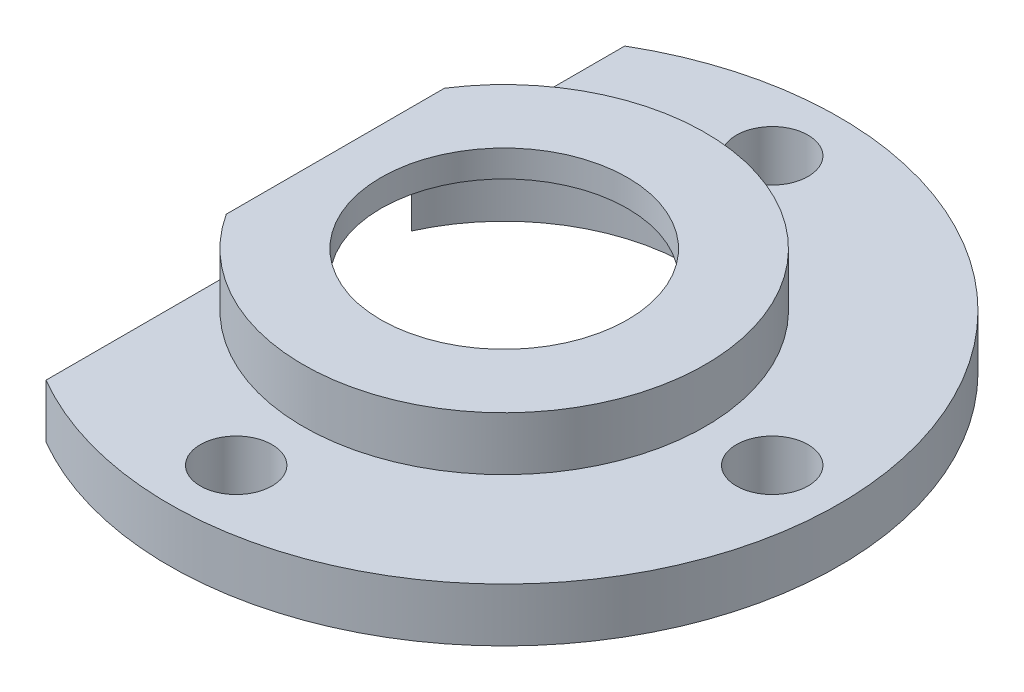
ISO-10303-21;
HEADER;
FILE_DESCRIPTION(('STEP AP214'),'2;1');
FILE_NAME('part.step','',(''),(''),'','','');
FILE_SCHEMA(('AUTOMOTIVE_DESIGN { 1 0 10303 214 1 1 1 1 }'));
ENDSEC;
DATA;
#1=APPLICATION_CONTEXT('core data for automotive mechanical design processes');
#2=APPLICATION_PROTOCOL_DEFINITION('international standard','automotive_design',2000,#1);
#3=PRODUCT_CONTEXT('',#1,'mechanical');
#4=PRODUCT('Part','Part','',(#3));
#5=PRODUCT_RELATED_PRODUCT_CATEGORY('part','',(#4));
#6=PRODUCT_DEFINITION_FORMATION('','',#4);
#7=PRODUCT_DEFINITION_CONTEXT('part definition',#1,'design');
#8=PRODUCT_DEFINITION('design','',#6,#7);
#9=PRODUCT_DEFINITION_SHAPE('','',#8);
#10=(LENGTH_UNIT() NAMED_UNIT(*) SI_UNIT(.MILLI.,.METRE.));
#11=(NAMED_UNIT(*) PLANE_ANGLE_UNIT() SI_UNIT($,.RADIAN.));
#12=(NAMED_UNIT(*) SI_UNIT($,.STERADIAN.) SOLID_ANGLE_UNIT());
#13=UNCERTAINTY_MEASURE_WITH_UNIT(LENGTH_MEASURE(1.E-05),#10,'distance_accuracy_value','');
#14=(GEOMETRIC_REPRESENTATION_CONTEXT(3) GLOBAL_UNCERTAINTY_ASSIGNED_CONTEXT((#13)) GLOBAL_UNIT_ASSIGNED_CONTEXT((#10,
#11,#12)) REPRESENTATION_CONTEXT('',''));
#15=CARTESIAN_POINT('',(0.,0.,0.));
#16=DIRECTION('',(0.,0.,1.));
#17=DIRECTION('',(1.,0.,0.));
#18=AXIS2_PLACEMENT_3D('',#15,#16,#17);
#19=CARTESIAN_POINT('',(0.,2.54,0.));
#20=DIRECTION('',(0.,-1.,0.));
#21=DIRECTION('',(0.,0.,-1.));
#22=AXIS2_PLACEMENT_3D('',#19,#20,#21);
#23=CYLINDRICAL_SURFACE('',#22,15.875);
#24=DIRECTION('',(0.,-1.,0.));
#25=VECTOR('',#24,1.);
#26=CARTESIAN_POINT('',(-8.,5.33400000000001,-13.7118789740867));
#27=LINE('',#26,#25);
#28=CARTESIAN_POINT('',(-8.,2.54,-13.7118789740867));
#29=VERTEX_POINT('',#28);
#30=CARTESIAN_POINT('',(-8.,0.,-13.7118789740867));
#31=VERTEX_POINT('',#30);
#32=EDGE_CURVE('E92',#29,#31,#27,.T.);
#33=ORIENTED_EDGE('',*,*,#32,.F.);
#34=CARTESIAN_POINT('',(0.,2.54,0.));
#35=DIRECTION('',(0.,1.,0.));
#36=DIRECTION('',(0.,0.,1.));
#37=AXIS2_PLACEMENT_3D('',#34,#35,#36);
#38=CIRCLE('',#37,15.875);
#39=CARTESIAN_POINT('',(-8.,2.54,13.7118789740867));
#40=VERTEX_POINT('',#39);
#41=EDGE_CURVE('E118',#40,#29,#38,.T.);
#42=ORIENTED_EDGE('',*,*,#41,.F.);
#43=DIRECTION('',(0.,-1.,0.));
#44=VECTOR('',#43,1.);
#45=CARTESIAN_POINT('',(-8.,5.33400000000001,13.7118789740867));
#46=LINE('',#45,#44);
#47=CARTESIAN_POINT('',(-8.,0.,13.7118789740867));
#48=VERTEX_POINT('',#47);
#49=EDGE_CURVE('E104',#40,#48,#46,.T.);
#50=ORIENTED_EDGE('',*,*,#49,.T.);
#51=CARTESIAN_POINT('',(0.,0.,0.));
#52=DIRECTION('',(0.,1.,0.));
#53=DIRECTION('',(0.,0.,1.));
#54=AXIS2_PLACEMENT_3D('',#51,#52,#53);
#55=CIRCLE('',#54,15.875);
#56=EDGE_CURVE('E110',#48,#31,#55,.T.);
#57=ORIENTED_EDGE('',*,*,#56,.T.);
#58=EDGE_LOOP('',(#33,#42,#50,#57));
#59=FACE_BOUND('',#58,.T.);
#60=ADVANCED_FACE('F43',(#59),#23,.T.);
#61=CARTESIAN_POINT('',(0.,2.54,0.));
#62=DIRECTION('',(0.,1.,0.));
#63=DIRECTION('',(0.,0.,1.));
#64=AXIS2_PLACEMENT_3D('',#61,#62,#63);
#65=PLANE('',#64);
#66=CARTESIAN_POINT('',(0.,2.54,12.7));
#67=DIRECTION('',(0.,1.,0.));
#68=DIRECTION('',(0.,0.,1.));
#69=AXIS2_PLACEMENT_3D('',#66,#67,#68);
#70=CIRCLE('',#69,1.7);
#71=CARTESIAN_POINT('',(0.,2.54,14.4));
#72=VERTEX_POINT('',#71);
#73=EDGE_CURVE('E144',#72,#72,#70,.T.);
#74=ORIENTED_EDGE('',*,*,#73,.F.);
#75=EDGE_LOOP('',(#74));
#76=FACE_BOUND('',#75,.T.);
#77=CARTESIAN_POINT('',(12.7,2.54,0.));
#78=DIRECTION('',(0.,1.,0.));
#79=DIRECTION('',(0.,0.,1.));
#80=AXIS2_PLACEMENT_3D('',#77,#78,#79);
#81=CIRCLE('',#80,1.70000000000004);
#82=CARTESIAN_POINT('',(12.7,2.54,1.70000000000004));
#83=VERTEX_POINT('',#82);
#84=EDGE_CURVE('E153',#83,#83,#81,.T.);
#85=ORIENTED_EDGE('',*,*,#84,.F.);
#86=EDGE_LOOP('',(#85));
#87=FACE_BOUND('',#86,.T.);
#88=CARTESIAN_POINT('',(0.,2.54,-12.7));
#89=DIRECTION('',(0.,1.,0.));
#90=DIRECTION('',(0.,0.,1.));
#91=AXIS2_PLACEMENT_3D('',#88,#89,#90);
#92=CIRCLE('',#91,1.7);
#93=CARTESIAN_POINT('',(0.,2.54,-11.));
#94=VERTEX_POINT('',#93);
#95=EDGE_CURVE('E157',#94,#94,#92,.T.);
#96=ORIENTED_EDGE('',*,*,#95,.F.);
#97=EDGE_LOOP('',(#96));
#98=FACE_BOUND('',#97,.T.);
#99=ORIENTED_EDGE('',*,*,#41,.T.);
#100=DIRECTION('',(0.,0.,1.));
#101=VECTOR('',#100,1.);
#102=CARTESIAN_POINT('',(-8.,2.54,0.));
#103=LINE('',#102,#101);
#104=CARTESIAN_POINT('',(-8.,2.54,-5.16968325915621));
#105=VERTEX_POINT('',#104);
#106=EDGE_CURVE('E97',#29,#105,#103,.T.);
#107=ORIENTED_EDGE('',*,*,#106,.T.);
#108=CARTESIAN_POINT('',(0.,2.54,0.));
#109=DIRECTION('',(0.,1.,0.));
#110=DIRECTION('',(0.,0.,1.));
#111=AXIS2_PLACEMENT_3D('',#108,#109,#110);
#112=CIRCLE('',#111,9.525);
#113=CARTESIAN_POINT('',(-8.,2.54,5.16968325915621));
#114=VERTEX_POINT('',#113);
#115=EDGE_CURVE('E51',#114,#105,#112,.T.);
#116=ORIENTED_EDGE('',*,*,#115,.F.);
#117=EDGE_CURVE('E167',#114,#40,#103,.T.);
#118=ORIENTED_EDGE('',*,*,#117,.T.);
#119=EDGE_LOOP('',(#99,#107,#116,#118));
#120=FACE_BOUND('',#119,.T.);
#121=ADVANCED_FACE('F206',(#76,#87,#98,#120),#65,.T.);
#122=CARTESIAN_POINT('',(0.,0.,0.));
#123=DIRECTION('',(0.,1.,0.));
#124=DIRECTION('',(0.,0.,1.));
#125=AXIS2_PLACEMENT_3D('',#122,#123,#124);
#126=PLANE('',#125);
#127=CARTESIAN_POINT('',(0.,0.,12.7));
#128=DIRECTION('',(0.,1.,0.));
#129=DIRECTION('',(0.,0.,1.));
#130=AXIS2_PLACEMENT_3D('',#127,#128,#129);
#131=CIRCLE('',#130,1.7);
#132=CARTESIAN_POINT('',(0.,0.,14.4));
#133=VERTEX_POINT('',#132);
#134=EDGE_CURVE('E149',#133,#133,#131,.F.);
#135=ORIENTED_EDGE('',*,*,#134,.F.);
#136=EDGE_LOOP('',(#135));
#137=FACE_BOUND('',#136,.T.);
#138=CARTESIAN_POINT('',(12.7,0.,0.));
#139=DIRECTION('',(0.,1.,0.));
#140=DIRECTION('',(0.,0.,1.));
#141=AXIS2_PLACEMENT_3D('',#138,#139,#140);
#142=CIRCLE('',#141,1.70000000000004);
#143=CARTESIAN_POINT('',(12.7,0.,1.70000000000004));
#144=VERTEX_POINT('',#143);
#145=EDGE_CURVE('E148',#144,#144,#142,.F.);
#146=ORIENTED_EDGE('',*,*,#145,.F.);
#147=EDGE_LOOP('',(#146));
#148=FACE_BOUND('',#147,.T.);
#149=CARTESIAN_POINT('',(0.,0.,-12.7));
#150=DIRECTION('',(0.,1.,0.));
#151=DIRECTION('',(0.,0.,1.));
#152=AXIS2_PLACEMENT_3D('',#149,#150,#151);
#153=CIRCLE('',#152,1.7);
#154=CARTESIAN_POINT('',(0.,0.,-11.));
#155=VERTEX_POINT('',#154);
#156=EDGE_CURVE('E140',#155,#155,#153,.F.);
#157=ORIENTED_EDGE('',*,*,#156,.F.);
#158=EDGE_LOOP('',(#157));
#159=FACE_BOUND('',#158,.T.);
#160=DIRECTION('',(0.,0.,1.));
#161=VECTOR('',#160,1.);
#162=CARTESIAN_POINT('',(-8.,0.,0.));
#163=LINE('',#162,#161);
#164=CARTESIAN_POINT('',(-8.,0.,-3.60734119400979));
#165=VERTEX_POINT('',#164);
#166=EDGE_CURVE('E95',#31,#165,#163,.T.);
#167=ORIENTED_EDGE('',*,*,#166,.F.);
#168=ORIENTED_EDGE('',*,*,#56,.F.);
#169=CARTESIAN_POINT('',(-8.,0.,3.60734119400979));
#170=VERTEX_POINT('',#169);
#171=EDGE_CURVE('E114',#170,#48,#163,.T.);
#172=ORIENTED_EDGE('',*,*,#171,.F.);
#173=CARTESIAN_POINT('',(0.,0.,0.));
#174=DIRECTION('',(0.,-1.,0.));
#175=DIRECTION('',(0.,0.,-1.));
#176=AXIS2_PLACEMENT_3D('',#173,#174,#175);
#177=CIRCLE('',#176,8.7757);
#178=EDGE_CURVE('E112',#165,#170,#177,.T.);
#179=ORIENTED_EDGE('',*,*,#178,.F.);
#180=EDGE_LOOP('',(#167,#168,#172,#179));
#181=FACE_BOUND('',#180,.T.);
#182=ADVANCED_FACE('F108',(#137,#148,#159,#181),#126,.F.);
#183=CARTESIAN_POINT('',(0.,5.08,0.));
#184=DIRECTION('',(0.,-1.,0.));
#185=DIRECTION('',(0.,0.,-1.));
#186=AXIS2_PLACEMENT_3D('',#183,#184,#185);
#187=CYLINDRICAL_SURFACE('',#186,9.525);
#188=DIRECTION('',(0.,-1.,0.));
#189=VECTOR('',#188,1.);
#190=CARTESIAN_POINT('',(-8.,5.08,-5.16968325915621));
#191=LINE('',#190,#189);
#192=CARTESIAN_POINT('',(-8.,5.08,-5.16968325915621));
#193=VERTEX_POINT('',#192);
#194=EDGE_CURVE('E64',#193,#105,#191,.T.);
#195=ORIENTED_EDGE('',*,*,#194,.F.);
#196=CARTESIAN_POINT('',(0.,5.08,0.));
#197=DIRECTION('',(0.,1.,0.));
#198=DIRECTION('',(0.,0.,1.));
#199=AXIS2_PLACEMENT_3D('',#196,#197,#198);
#200=CIRCLE('',#199,9.525);
#201=CARTESIAN_POINT('',(-8.,5.08,5.16968325915621));
#202=VERTEX_POINT('',#201);
#203=EDGE_CURVE('E119',#202,#193,#200,.T.);
#204=ORIENTED_EDGE('',*,*,#203,.F.);
#205=DIRECTION('',(0.,-1.,0.));
#206=VECTOR('',#205,1.);
#207=CARTESIAN_POINT('',(-8.,5.08,5.16968325915621));
#208=LINE('',#207,#206);
#209=EDGE_CURVE('E173',#114,#202,#208,.F.);
#210=ORIENTED_EDGE('',*,*,#209,.F.);
#211=ORIENTED_EDGE('',*,*,#115,.T.);
#212=EDGE_LOOP('',(#195,#204,#210,#211));
#213=FACE_BOUND('',#212,.T.);
#214=ADVANCED_FACE('F215',(#213),#187,.T.);
#215=CARTESIAN_POINT('',(0.,5.08,0.));
#216=DIRECTION('',(0.,1.,0.));
#217=DIRECTION('',(0.,0.,1.));
#218=AXIS2_PLACEMENT_3D('',#215,#216,#217);
#219=PLANE('',#218);
#220=CARTESIAN_POINT('',(0.,5.08,0.));
#221=DIRECTION('',(0.,1.,0.));
#222=DIRECTION('',(0.,0.,1.));
#223=AXIS2_PLACEMENT_3D('',#220,#221,#222);
#224=CIRCLE('',#223,5.842);
#225=CARTESIAN_POINT('',(0.,5.08,5.842));
#226=VERTEX_POINT('',#225);
#227=EDGE_CURVE('E132',#226,#226,#224,.T.);
#228=ORIENTED_EDGE('',*,*,#227,.F.);
#229=EDGE_LOOP('',(#228));
#230=FACE_BOUND('',#229,.T.);
#231=ORIENTED_EDGE('',*,*,#203,.T.);
#232=DIRECTION('',(0.,0.,1.));
#233=VECTOR('',#232,1.);
#234=CARTESIAN_POINT('',(-8.,5.08,0.));
#235=LINE('',#234,#233);
#236=EDGE_CURVE('E176',#193,#202,#235,.T.);
#237=ORIENTED_EDGE('',*,*,#236,.T.);
#238=EDGE_LOOP('',(#231,#237));
#239=FACE_BOUND('',#238,.T.);
#240=ADVANCED_FACE('F203',(#230,#239),#219,.T.);
#241=CARTESIAN_POINT('',(0.,3.81,0.));
#242=DIRECTION('',(0.,-1.,0.));
#243=DIRECTION('',(0.,0.,-1.));
#244=AXIS2_PLACEMENT_3D('',#241,#242,#243);
#245=CYLINDRICAL_SURFACE('',#244,8.7757);
#246=DIRECTION('',(0.,-1.,0.));
#247=VECTOR('',#246,1.);
#248=CARTESIAN_POINT('',(-8.,3.81,-3.60734119400979));
#249=LINE('',#248,#247);
#250=CARTESIAN_POINT('',(-8.,3.81,-3.60734119400979));
#251=VERTEX_POINT('',#250);
#252=EDGE_CURVE('E58',#165,#251,#249,.F.);
#253=ORIENTED_EDGE('',*,*,#252,.F.);
#254=ORIENTED_EDGE('',*,*,#178,.T.);
#255=DIRECTION('',(0.,-1.,0.));
#256=VECTOR('',#255,1.);
#257=CARTESIAN_POINT('',(-8.,3.81,3.60734119400979));
#258=LINE('',#257,#256);
#259=CARTESIAN_POINT('',(-8.,3.81,3.60734119400979));
#260=VERTEX_POINT('',#259);
#261=EDGE_CURVE('E103',#260,#170,#258,.T.);
#262=ORIENTED_EDGE('',*,*,#261,.F.);
#263=CARTESIAN_POINT('',(0.,3.81,0.));
#264=DIRECTION('',(0.,-1.,0.));
#265=DIRECTION('',(0.,0.,-1.));
#266=AXIS2_PLACEMENT_3D('',#263,#264,#265);
#267=CIRCLE('',#266,8.7757);
#268=EDGE_CURVE('E124',#251,#260,#267,.T.);
#269=ORIENTED_EDGE('',*,*,#268,.F.);
#270=EDGE_LOOP('',(#253,#254,#262,#269));
#271=FACE_BOUND('',#270,.T.);
#272=ADVANCED_FACE('F188',(#271),#245,.F.);
#273=CARTESIAN_POINT('',(0.,3.81,0.));
#274=DIRECTION('',(0.,-1.,0.));
#275=DIRECTION('',(0.,0.,-1.));
#276=AXIS2_PLACEMENT_3D('',#273,#274,#275);
#277=PLANE('',#276);
#278=CARTESIAN_POINT('',(0.,3.81,0.));
#279=DIRECTION('',(0.,-1.,0.));
#280=DIRECTION('',(0.,0.,-1.));
#281=AXIS2_PLACEMENT_3D('',#278,#279,#280);
#282=CIRCLE('',#281,5.842);
#283=CARTESIAN_POINT('',(0.,3.81,-5.842));
#284=VERTEX_POINT('',#283);
#285=EDGE_CURVE('E136',#284,#284,#282,.F.);
#286=ORIENTED_EDGE('',*,*,#285,.T.);
#287=EDGE_LOOP('',(#286));
#288=FACE_BOUND('',#287,.T.);
#289=ORIENTED_EDGE('',*,*,#268,.T.);
#290=DIRECTION('',(0.,0.,-1.));
#291=VECTOR('',#290,1.);
#292=CARTESIAN_POINT('',(-8.,3.81,0.));
#293=LINE('',#292,#291);
#294=EDGE_CURVE('E11',#260,#251,#293,.T.);
#295=ORIENTED_EDGE('',*,*,#294,.T.);
#296=EDGE_LOOP('',(#289,#295));
#297=FACE_BOUND('',#296,.T.);
#298=ADVANCED_FACE('F191',(#288,#297),#277,.T.);
#299=CARTESIAN_POINT('',(0.,-0.00100000000000013,0.));
#300=DIRECTION('',(0.,1.,0.));
#301=DIRECTION('',(0.,0.,1.));
#302=AXIS2_PLACEMENT_3D('',#299,#300,#301);
#303=CYLINDRICAL_SURFACE('',#302,5.842);
#304=ORIENTED_EDGE('',*,*,#285,.F.);
#305=EDGE_LOOP('',(#304));
#306=FACE_BOUND('',#305,.T.);
#307=ORIENTED_EDGE('',*,*,#227,.T.);
#308=EDGE_LOOP('',(#307));
#309=FACE_BOUND('',#308,.T.);
#310=ADVANCED_FACE('F193',(#306,#309),#303,.F.);
#311=CARTESIAN_POINT('',(0.,-0.00100000000000013,12.7));
#312=DIRECTION('',(0.,1.,0.));
#313=DIRECTION('',(0.,0.,1.));
#314=AXIS2_PLACEMENT_3D('',#311,#312,#313);
#315=CYLINDRICAL_SURFACE('',#314,1.7);
#316=ORIENTED_EDGE('',*,*,#73,.T.);
#317=EDGE_LOOP('',(#316));
#318=FACE_BOUND('',#317,.T.);
#319=ORIENTED_EDGE('',*,*,#134,.T.);
#320=EDGE_LOOP('',(#319));
#321=FACE_BOUND('',#320,.T.);
#322=ADVANCED_FACE('F200',(#318,#321),#315,.F.);
#323=CARTESIAN_POINT('',(12.7,-0.00100000000000013,0.));
#324=DIRECTION('',(0.,1.,0.));
#325=DIRECTION('',(0.,0.,1.));
#326=AXIS2_PLACEMENT_3D('',#323,#324,#325);
#327=CYLINDRICAL_SURFACE('',#326,1.70000000000004);
#328=ORIENTED_EDGE('',*,*,#84,.T.);
#329=EDGE_LOOP('',(#328));
#330=FACE_BOUND('',#329,.T.);
#331=ORIENTED_EDGE('',*,*,#145,.T.);
#332=EDGE_LOOP('',(#331));
#333=FACE_BOUND('',#332,.T.);
#334=ADVANCED_FACE('F265',(#330,#333),#327,.F.);
#335=CARTESIAN_POINT('',(0.,-0.00100000000000013,-12.7));
#336=DIRECTION('',(0.,1.,0.));
#337=DIRECTION('',(0.,0.,1.));
#338=AXIS2_PLACEMENT_3D('',#335,#336,#337);
#339=CYLINDRICAL_SURFACE('',#338,1.7);
#340=ORIENTED_EDGE('',*,*,#95,.T.);
#341=EDGE_LOOP('',(#340));
#342=FACE_BOUND('',#341,.T.);
#343=ORIENTED_EDGE('',*,*,#156,.T.);
#344=EDGE_LOOP('',(#343));
#345=FACE_BOUND('',#344,.T.);
#346=ADVANCED_FACE('F254',(#342,#345),#339,.F.);
#347=CARTESIAN_POINT('',(-8.,5.33400000000001,0.));
#348=DIRECTION('',(-1.,0.,0.));
#349=DIRECTION('',(0.,0.,1.));
#350=AXIS2_PLACEMENT_3D('',#347,#348,#349);
#351=PLANE('',#350);
#352=ORIENTED_EDGE('',*,*,#32,.T.);
#353=ORIENTED_EDGE('',*,*,#166,.T.);
#354=ORIENTED_EDGE('',*,*,#252,.T.);
#355=ORIENTED_EDGE('',*,*,#294,.F.);
#356=ORIENTED_EDGE('',*,*,#261,.T.);
#357=ORIENTED_EDGE('',*,*,#171,.T.);
#358=ORIENTED_EDGE('',*,*,#49,.F.);
#359=ORIENTED_EDGE('',*,*,#117,.F.);
#360=ORIENTED_EDGE('',*,*,#209,.T.);
#361=ORIENTED_EDGE('',*,*,#236,.F.);
#362=ORIENTED_EDGE('',*,*,#194,.T.);
#363=ORIENTED_EDGE('',*,*,#106,.F.);
#364=EDGE_LOOP('',(#352,#353,#354,#355,#356,#357,#358,#359,#360,#361,#362,#363));
#365=FACE_BOUND('',#364,.T.);
#366=ADVANCED_FACE('F94',(#365),#351,.T.);
#367=CLOSED_SHELL('',(#60,#121,#182,#214,#240,#272,#298,#310,#322,#334,#346,#366));
#368=MANIFOLD_SOLID_BREP('B2',#367);
#369=ADVANCED_BREP_SHAPE_REPRESENTATION('',(#18,#368),#14);
#370=SHAPE_DEFINITION_REPRESENTATION(#9,#369);
ENDSEC;
END-ISO-10303-21;
